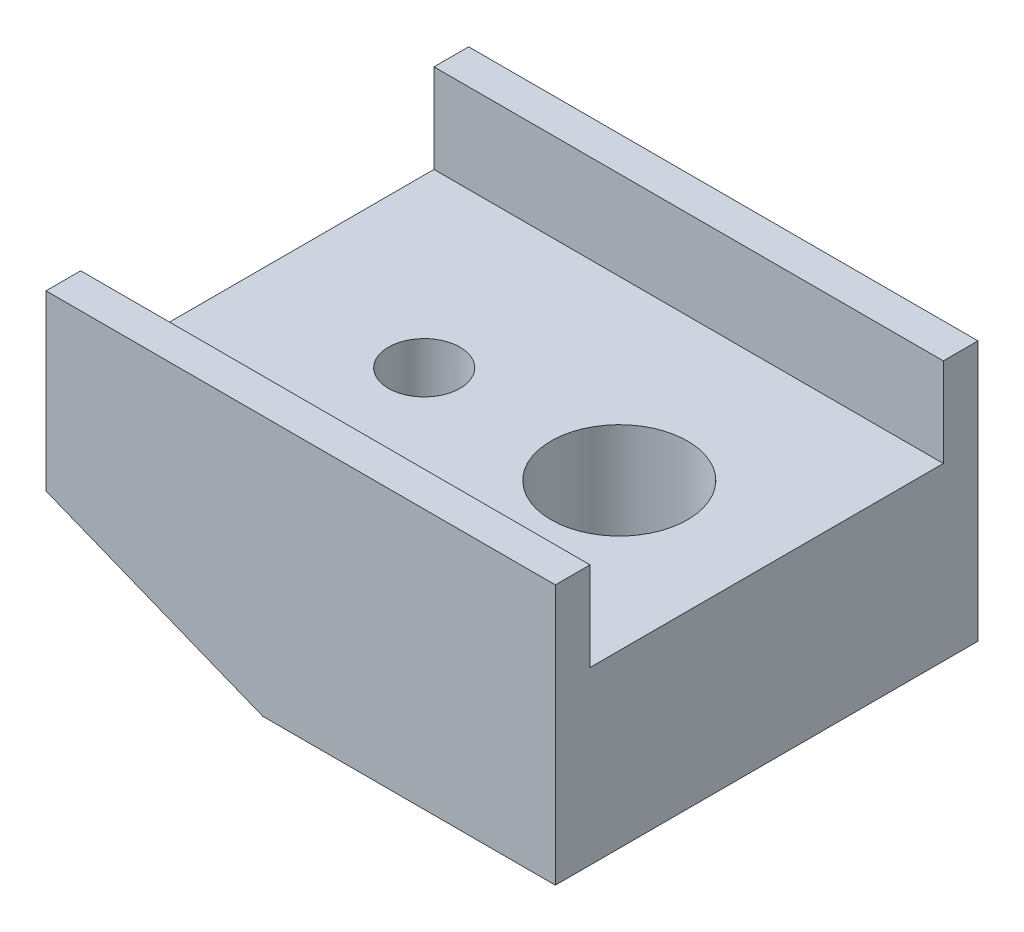
ISO-10303-21;
HEADER;
FILE_DESCRIPTION(('STEP AP214'),'2;1');
FILE_NAME('part.step','',(''),(''),'','','');
FILE_SCHEMA(('AUTOMOTIVE_DESIGN { 1 0 10303 214 1 1 1 1 }'));
ENDSEC;
DATA;
#1=APPLICATION_CONTEXT('core data for automotive mechanical design processes');
#2=APPLICATION_PROTOCOL_DEFINITION('international standard','automotive_design',2000,#1);
#3=PRODUCT_CONTEXT('',#1,'mechanical');
#4=PRODUCT('Part','Part','',(#3));
#5=PRODUCT_RELATED_PRODUCT_CATEGORY('part','',(#4));
#6=PRODUCT_DEFINITION_FORMATION('','',#4);
#7=PRODUCT_DEFINITION_CONTEXT('part definition',#1,'design');
#8=PRODUCT_DEFINITION('design','',#6,#7);
#9=PRODUCT_DEFINITION_SHAPE('','',#8);
#10=(LENGTH_UNIT() NAMED_UNIT(*) SI_UNIT(.MILLI.,.METRE.));
#11=(NAMED_UNIT(*) PLANE_ANGLE_UNIT() SI_UNIT($,.RADIAN.));
#12=(NAMED_UNIT(*) SI_UNIT($,.STERADIAN.) SOLID_ANGLE_UNIT());
#13=UNCERTAINTY_MEASURE_WITH_UNIT(LENGTH_MEASURE(1.E-05),#10,'distance_accuracy_value','');
#14=(GEOMETRIC_REPRESENTATION_CONTEXT(3) GLOBAL_UNCERTAINTY_ASSIGNED_CONTEXT((#13)) GLOBAL_UNIT_ASSIGNED_CONTEXT((#10,
#11,#12)) REPRESENTATION_CONTEXT('',''));
#15=CARTESIAN_POINT('',(0.,0.,0.));
#16=DIRECTION('',(0.,0.,1.));
#17=DIRECTION('',(1.,0.,0.));
#18=AXIS2_PLACEMENT_3D('',#15,#16,#17);
#19=CARTESIAN_POINT('',(0.,12.,19.5));
#20=DIRECTION('',(0.,-1.,0.));
#21=DIRECTION('',(0.,0.,-1.));
#22=AXIS2_PLACEMENT_3D('',#19,#20,#21);
#23=PLANE('',#22);
#24=DIRECTION('',(0.,0.,-1.));
#25=VECTOR('',#24,1.);
#26=CARTESIAN_POINT('',(0.,12.,19.5));
#27=LINE('',#26,#25);
#28=CARTESIAN_POINT('',(0.,12.,19.5));
#29=VERTEX_POINT('',#28);
#30=CARTESIAN_POINT('',(0.,12.,17.9));
#31=VERTEX_POINT('',#30);
#32=EDGE_CURVE('E11',#29,#31,#27,.T.);
#33=ORIENTED_EDGE('',*,*,#32,.T.);
#34=DIRECTION('',(1.,0.,0.));
#35=VECTOR('',#34,1.);
#36=CARTESIAN_POINT('',(-23.5,12.,17.9));
#37=LINE('',#36,#35);
#38=CARTESIAN_POINT('',(-23.5,12.,17.9));
#39=VERTEX_POINT('',#38);
#40=EDGE_CURVE('E172',#39,#31,#37,.T.);
#41=ORIENTED_EDGE('',*,*,#40,.F.);
#42=DIRECTION('',(0.,0.,-1.));
#43=VECTOR('',#42,1.);
#44=CARTESIAN_POINT('',(-23.5,12.,19.5));
#45=LINE('',#44,#43);
#46=CARTESIAN_POINT('',(-23.5,12.,19.5));
#47=VERTEX_POINT('',#46);
#48=EDGE_CURVE('E146',#47,#39,#45,.T.);
#49=ORIENTED_EDGE('',*,*,#48,.F.);
#50=DIRECTION('',(-1.,0.,0.));
#51=VECTOR('',#50,1.);
#52=CARTESIAN_POINT('',(0.,12.,19.5));
#53=LINE('',#52,#51);
#54=EDGE_CURVE('E101',#29,#47,#53,.T.);
#55=ORIENTED_EDGE('',*,*,#54,.F.);
#56=EDGE_LOOP('',(#33,#41,#49,#55));
#57=FACE_BOUND('',#56,.T.);
#58=ADVANCED_FACE('F45',(#57),#23,.F.);
#59=CARTESIAN_POINT('',(0.,0.,19.5));
#60=DIRECTION('',(-1.,0.,0.));
#61=DIRECTION('',(0.,0.,1.));
#62=AXIS2_PLACEMENT_3D('',#59,#60,#61);
#63=PLANE('',#62);
#64=DIRECTION('',(0.,0.,1.));
#65=VECTOR('',#64,1.);
#66=CARTESIAN_POINT('',(0.,7.90000000000001,0.));
#67=LINE('',#66,#65);
#68=CARTESIAN_POINT('',(0.,7.90000000000001,1.6));
#69=VERTEX_POINT('',#68);
#70=CARTESIAN_POINT('',(0.,7.90000000000001,17.9));
#71=VERTEX_POINT('',#70);
#72=EDGE_CURVE('E183',#69,#71,#67,.T.);
#73=ORIENTED_EDGE('',*,*,#72,.T.);
#74=DIRECTION('',(0.,-1.,0.));
#75=VECTOR('',#74,1.);
#76=CARTESIAN_POINT('',(0.,0.,17.9));
#77=LINE('',#76,#75);
#78=EDGE_CURVE('E177',#31,#71,#77,.T.);
#79=ORIENTED_EDGE('',*,*,#78,.F.);
#80=ORIENTED_EDGE('',*,*,#32,.F.);
#81=DIRECTION('',(0.,1.,0.));
#82=VECTOR('',#81,1.);
#83=CARTESIAN_POINT('',(0.,0.,19.5));
#84=LINE('',#83,#82);
#85=CARTESIAN_POINT('',(0.,0.,19.5));
#86=VERTEX_POINT('',#85);
#87=EDGE_CURVE('E144',#86,#29,#84,.T.);
#88=ORIENTED_EDGE('',*,*,#87,.F.);
#89=DIRECTION('',(0.,0.,-1.));
#90=VECTOR('',#89,1.);
#91=CARTESIAN_POINT('',(0.,0.,19.5));
#92=LINE('',#91,#90);
#93=CARTESIAN_POINT('',(0.,0.,0.));
#94=VERTEX_POINT('',#93);
#95=EDGE_CURVE('E129',#86,#94,#92,.T.);
#96=ORIENTED_EDGE('',*,*,#95,.T.);
#97=DIRECTION('',(0.,1.,0.));
#98=VECTOR('',#97,1.);
#99=CARTESIAN_POINT('',(0.,0.,0.));
#100=LINE('',#99,#98);
#101=CARTESIAN_POINT('',(0.,12.,0.));
#102=VERTEX_POINT('',#101);
#103=EDGE_CURVE('E133',#94,#102,#100,.T.);
#104=ORIENTED_EDGE('',*,*,#103,.T.);
#105=CARTESIAN_POINT('',(0.,12.,1.6));
#106=VERTEX_POINT('',#105);
#107=EDGE_CURVE('E53',#106,#102,#27,.T.);
#108=ORIENTED_EDGE('',*,*,#107,.F.);
#109=DIRECTION('',(0.,1.,0.));
#110=VECTOR('',#109,1.);
#111=CARTESIAN_POINT('',(0.,0.,1.6));
#112=LINE('',#111,#110);
#113=EDGE_CURVE('E181',#69,#106,#112,.T.);
#114=ORIENTED_EDGE('',*,*,#113,.F.);
#115=EDGE_LOOP('',(#73,#79,#80,#88,#96,#104,#108,#114));
#116=FACE_BOUND('',#115,.T.);
#117=ADVANCED_FACE('F47',(#116),#63,.F.);
#118=CARTESIAN_POINT('',(-23.5,12.,1.6));
#119=VERTEX_POINT('',#118);
#120=CARTESIAN_POINT('',(-23.5,12.,0.));
#121=VERTEX_POINT('',#120);
#122=EDGE_CURVE('E124',#119,#121,#45,.T.);
#123=ORIENTED_EDGE('',*,*,#122,.F.);
#124=DIRECTION('',(1.,0.,0.));
#125=VECTOR('',#124,1.);
#126=CARTESIAN_POINT('',(-23.5,12.,1.6));
#127=LINE('',#126,#125);
#128=EDGE_CURVE('E60',#119,#106,#127,.T.);
#129=ORIENTED_EDGE('',*,*,#128,.T.);
#130=ORIENTED_EDGE('',*,*,#107,.T.);
#131=DIRECTION('',(-1.,0.,0.));
#132=VECTOR('',#131,1.);
#133=CARTESIAN_POINT('',(0.,12.,0.));
#134=LINE('',#133,#132);
#135=EDGE_CURVE('E136',#102,#121,#134,.T.);
#136=ORIENTED_EDGE('',*,*,#135,.T.);
#137=EDGE_LOOP('',(#123,#129,#130,#136));
#138=FACE_BOUND('',#137,.T.);
#139=ADVANCED_FACE('F154',(#138),#23,.F.);
#140=CARTESIAN_POINT('',(-23.5,4.,19.5));
#141=DIRECTION('',(1.,0.,0.));
#142=DIRECTION('',(0.,1.,0.));
#143=AXIS2_PLACEMENT_3D('',#140,#141,#142);
#144=PLANE('',#143);
#145=ORIENTED_EDGE('',*,*,#48,.T.);
#146=DIRECTION('',(0.,-1.,0.));
#147=VECTOR('',#146,1.);
#148=CARTESIAN_POINT('',(-23.5,0.,17.9));
#149=LINE('',#148,#147);
#150=CARTESIAN_POINT('',(-23.5,7.90000000000001,17.9));
#151=VERTEX_POINT('',#150);
#152=EDGE_CURVE('E170',#39,#151,#149,.T.);
#153=ORIENTED_EDGE('',*,*,#152,.T.);
#154=DIRECTION('',(0.,0.,1.));
#155=VECTOR('',#154,1.);
#156=CARTESIAN_POINT('',(-23.5,7.90000000000001,0.));
#157=LINE('',#156,#155);
#158=CARTESIAN_POINT('',(-23.5,7.90000000000001,1.6));
#159=VERTEX_POINT('',#158);
#160=EDGE_CURVE('E180',#159,#151,#157,.T.);
#161=ORIENTED_EDGE('',*,*,#160,.F.);
#162=DIRECTION('',(0.,1.,0.));
#163=VECTOR('',#162,1.);
#164=CARTESIAN_POINT('',(-23.5,0.,1.6));
#165=LINE('',#164,#163);
#166=EDGE_CURVE('E151',#159,#119,#165,.T.);
#167=ORIENTED_EDGE('',*,*,#166,.T.);
#168=ORIENTED_EDGE('',*,*,#122,.T.);
#169=DIRECTION('',(0.,-1.,0.));
#170=VECTOR('',#169,1.);
#171=CARTESIAN_POINT('',(-23.5,4.,0.));
#172=LINE('',#171,#170);
#173=CARTESIAN_POINT('',(-23.5,4.,0.));
#174=VERTEX_POINT('',#173);
#175=EDGE_CURVE('E121',#121,#174,#172,.T.);
#176=ORIENTED_EDGE('',*,*,#175,.T.);
#177=DIRECTION('',(0.,0.,-1.));
#178=VECTOR('',#177,1.);
#179=CARTESIAN_POINT('',(-23.5,4.,19.5));
#180=LINE('',#179,#178);
#181=CARTESIAN_POINT('',(-23.5,4.,19.5));
#182=VERTEX_POINT('',#181);
#183=EDGE_CURVE('E118',#182,#174,#180,.T.);
#184=ORIENTED_EDGE('',*,*,#183,.F.);
#185=DIRECTION('',(0.,-1.,0.));
#186=VECTOR('',#185,1.);
#187=CARTESIAN_POINT('',(-23.5,4.,19.5));
#188=LINE('',#187,#186);
#189=EDGE_CURVE('E108',#47,#182,#188,.T.);
#190=ORIENTED_EDGE('',*,*,#189,.F.);
#191=EDGE_LOOP('',(#145,#153,#161,#167,#168,#176,#184,#190));
#192=FACE_BOUND('',#191,.T.);
#193=ADVANCED_FACE('F119',(#192),#144,.F.);
#194=CARTESIAN_POINT('',(-13.5,0.,19.5));
#195=DIRECTION('',(0.371390676354103,0.928476690885259,0.));
#196=DIRECTION('',(-0.92847669088526,0.371390676354103,0.));
#197=AXIS2_PLACEMENT_3D('',#194,#195,#196);
#198=PLANE('',#197);
#199=CARTESIAN_POINT('',(-15.8,0.92000000000001,9.75));
#200=DIRECTION('',(0.371390676354103,0.928476690885259,0.));
#201=DIRECTION('',(-0.92847669088526,0.371390676354103,0.));
#202=AXIS2_PLACEMENT_3D('',#199,#200,#201);
#203=ELLIPSE('',#202,1.77710438635438,1.65);
#204=CARTESIAN_POINT('',(-17.45,1.58000000000001,9.75));
#205=VERTEX_POINT('',#204);
#206=EDGE_CURVE('E195',#205,#205,#203,.T.);
#207=ORIENTED_EDGE('',*,*,#206,.T.);
#208=EDGE_LOOP('',(#207));
#209=FACE_BOUND('',#208,.T.);
#210=DIRECTION('',(0.92847669088526,-0.371390676354103,0.));
#211=VECTOR('',#210,1.);
#212=CARTESIAN_POINT('',(-13.5,0.,0.));
#213=LINE('',#212,#211);
#214=CARTESIAN_POINT('',(-13.5,0.,0.));
#215=VERTEX_POINT('',#214);
#216=EDGE_CURVE('E141',#174,#215,#213,.T.);
#217=ORIENTED_EDGE('',*,*,#216,.T.);
#218=DIRECTION('',(0.,0.,-1.));
#219=VECTOR('',#218,1.);
#220=CARTESIAN_POINT('',(-13.5,0.,19.5));
#221=LINE('',#220,#219);
#222=CARTESIAN_POINT('',(-13.5,0.,19.5));
#223=VERTEX_POINT('',#222);
#224=EDGE_CURVE('E125',#223,#215,#221,.T.);
#225=ORIENTED_EDGE('',*,*,#224,.F.);
#226=DIRECTION('',(0.92847669088526,-0.371390676354103,0.));
#227=VECTOR('',#226,1.);
#228=CARTESIAN_POINT('',(-13.5,0.,19.5));
#229=LINE('',#228,#227);
#230=EDGE_CURVE('E112',#182,#223,#229,.T.);
#231=ORIENTED_EDGE('',*,*,#230,.F.);
#232=ORIENTED_EDGE('',*,*,#183,.T.);
#233=EDGE_LOOP('',(#217,#225,#231,#232));
#234=FACE_BOUND('',#233,.T.);
#235=ADVANCED_FACE('F127',(#209,#234),#198,.F.);
#236=CARTESIAN_POINT('',(0.,0.,19.5));
#237=DIRECTION('',(0.,1.,0.));
#238=DIRECTION('',(-1.,0.,0.));
#239=AXIS2_PLACEMENT_3D('',#236,#237,#238);
#240=PLANE('',#239);
#241=CARTESIAN_POINT('',(-6.8,0.,9.75));
#242=DIRECTION('',(0.,1.,0.));
#243=DIRECTION('',(0.,0.,1.));
#244=AXIS2_PLACEMENT_3D('',#241,#242,#243);
#245=CIRCLE('',#244,3.14999999999999);
#246=CARTESIAN_POINT('',(-6.8,0.,12.9));
#247=VERTEX_POINT('',#246);
#248=EDGE_CURVE('E192',#247,#247,#245,.T.);
#249=ORIENTED_EDGE('',*,*,#248,.T.);
#250=EDGE_LOOP('',(#249));
#251=FACE_BOUND('',#250,.T.);
#252=DIRECTION('',(1.,0.,0.));
#253=VECTOR('',#252,1.);
#254=CARTESIAN_POINT('',(0.,0.,0.));
#255=LINE('',#254,#253);
#256=EDGE_CURVE('E93',#215,#94,#255,.T.);
#257=ORIENTED_EDGE('',*,*,#256,.T.);
#258=ORIENTED_EDGE('',*,*,#95,.F.);
#259=DIRECTION('',(1.,0.,0.));
#260=VECTOR('',#259,1.);
#261=CARTESIAN_POINT('',(0.,0.,19.5));
#262=LINE('',#261,#260);
#263=EDGE_CURVE('E69',#223,#86,#262,.T.);
#264=ORIENTED_EDGE('',*,*,#263,.F.);
#265=ORIENTED_EDGE('',*,*,#224,.T.);
#266=EDGE_LOOP('',(#257,#258,#264,#265));
#267=FACE_BOUND('',#266,.T.);
#268=ADVANCED_FACE('F159',(#251,#267),#240,.F.);
#269=CARTESIAN_POINT('',(0.,12.,19.5));
#270=DIRECTION('',(0.,0.,1.));
#271=DIRECTION('',(1.,0.,0.));
#272=AXIS2_PLACEMENT_3D('',#269,#270,#271);
#273=PLANE('',#272);
#274=ORIENTED_EDGE('',*,*,#87,.T.);
#275=ORIENTED_EDGE('',*,*,#54,.T.);
#276=ORIENTED_EDGE('',*,*,#189,.T.);
#277=ORIENTED_EDGE('',*,*,#230,.T.);
#278=ORIENTED_EDGE('',*,*,#263,.T.);
#279=EDGE_LOOP('',(#274,#275,#276,#277,#278));
#280=FACE_BOUND('',#279,.T.);
#281=ADVANCED_FACE('F110',(#280),#273,.T.);
#282=CARTESIAN_POINT('',(0.,12.,0.));
#283=DIRECTION('',(0.,0.,1.));
#284=DIRECTION('',(1.,0.,0.));
#285=AXIS2_PLACEMENT_3D('',#282,#283,#284);
#286=PLANE('',#285);
#287=ORIENTED_EDGE('',*,*,#103,.F.);
#288=ORIENTED_EDGE('',*,*,#256,.F.);
#289=ORIENTED_EDGE('',*,*,#216,.F.);
#290=ORIENTED_EDGE('',*,*,#175,.F.);
#291=ORIENTED_EDGE('',*,*,#135,.F.);
#292=EDGE_LOOP('',(#287,#288,#289,#290,#291));
#293=FACE_BOUND('',#292,.T.);
#294=ADVANCED_FACE('F158',(#293),#286,.F.);
#295=CARTESIAN_POINT('',(-23.5,7.90000000000001,0.));
#296=DIRECTION('',(0.,1.,0.));
#297=DIRECTION('',(0.,0.,1.));
#298=AXIS2_PLACEMENT_3D('',#295,#296,#297);
#299=PLANE('',#298);
#300=CARTESIAN_POINT('',(-15.8,7.90000000000001,9.75));
#301=DIRECTION('',(0.,1.,0.));
#302=DIRECTION('',(0.,0.,1.));
#303=AXIS2_PLACEMENT_3D('',#300,#301,#302);
#304=CIRCLE('',#303,1.65);
#305=CARTESIAN_POINT('',(-15.8,7.90000000000001,11.4));
#306=VERTEX_POINT('',#305);
#307=EDGE_CURVE('E198',#306,#306,#304,.T.);
#308=ORIENTED_EDGE('',*,*,#307,.F.);
#309=EDGE_LOOP('',(#308));
#310=FACE_BOUND('',#309,.T.);
#311=CARTESIAN_POINT('',(-6.8,7.90000000000001,9.75));
#312=DIRECTION('',(0.,1.,0.));
#313=DIRECTION('',(0.,0.,1.));
#314=AXIS2_PLACEMENT_3D('',#311,#312,#313);
#315=CIRCLE('',#314,3.15);
#316=CARTESIAN_POINT('',(-6.8,7.90000000000001,12.9));
#317=VERTEX_POINT('',#316);
#318=EDGE_CURVE('E185',#317,#317,#315,.T.);
#319=ORIENTED_EDGE('',*,*,#318,.F.);
#320=EDGE_LOOP('',(#319));
#321=FACE_BOUND('',#320,.T.);
#322=ORIENTED_EDGE('',*,*,#72,.F.);
#323=DIRECTION('',(1.,0.,0.));
#324=VECTOR('',#323,1.);
#325=CARTESIAN_POINT('',(-23.5,7.90000000000001,1.6));
#326=LINE('',#325,#324);
#327=EDGE_CURVE('E167',#159,#69,#326,.T.);
#328=ORIENTED_EDGE('',*,*,#327,.F.);
#329=ORIENTED_EDGE('',*,*,#160,.T.);
#330=DIRECTION('',(1.,0.,0.));
#331=VECTOR('',#330,1.);
#332=CARTESIAN_POINT('',(-23.5,7.90000000000001,17.9));
#333=LINE('',#332,#331);
#334=EDGE_CURVE('E137',#151,#71,#333,.T.);
#335=ORIENTED_EDGE('',*,*,#334,.T.);
#336=EDGE_LOOP('',(#322,#328,#329,#335));
#337=FACE_BOUND('',#336,.T.);
#338=ADVANCED_FACE('F205',(#310,#321,#337),#299,.T.);
#339=CARTESIAN_POINT('',(-23.5,0.,17.9));
#340=DIRECTION('',(0.,0.,1.));
#341=DIRECTION('',(1.,0.,0.));
#342=AXIS2_PLACEMENT_3D('',#339,#340,#341);
#343=PLANE('',#342);
#344=ORIENTED_EDGE('',*,*,#78,.T.);
#345=ORIENTED_EDGE('',*,*,#334,.F.);
#346=ORIENTED_EDGE('',*,*,#152,.F.);
#347=ORIENTED_EDGE('',*,*,#40,.T.);
#348=EDGE_LOOP('',(#344,#345,#346,#347));
#349=FACE_BOUND('',#348,.T.);
#350=ADVANCED_FACE('F208',(#349),#343,.F.);
#351=CARTESIAN_POINT('',(-23.5,0.,1.6));
#352=DIRECTION('',(0.,0.,-1.));
#353=DIRECTION('',(-1.,0.,0.));
#354=AXIS2_PLACEMENT_3D('',#351,#352,#353);
#355=PLANE('',#354);
#356=ORIENTED_EDGE('',*,*,#113,.T.);
#357=ORIENTED_EDGE('',*,*,#128,.F.);
#358=ORIENTED_EDGE('',*,*,#166,.F.);
#359=ORIENTED_EDGE('',*,*,#327,.T.);
#360=EDGE_LOOP('',(#356,#357,#358,#359));
#361=FACE_BOUND('',#360,.T.);
#362=ADVANCED_FACE('F220',(#361),#355,.F.);
#363=CARTESIAN_POINT('',(-6.8,7.90000000000001,9.75));
#364=DIRECTION('',(0.,1.,0.));
#365=DIRECTION('',(0.,0.,1.));
#366=AXIS2_PLACEMENT_3D('',#363,#364,#365);
#367=CYLINDRICAL_SURFACE('',#366,3.15);
#368=ORIENTED_EDGE('',*,*,#248,.F.);
#369=EDGE_LOOP('',(#368));
#370=FACE_BOUND('',#369,.T.);
#371=ORIENTED_EDGE('',*,*,#318,.T.);
#372=EDGE_LOOP('',(#371));
#373=FACE_BOUND('',#372,.T.);
#374=ADVANCED_FACE('F254',(#370,#373),#367,.F.);
#375=CARTESIAN_POINT('',(-15.8,7.90000000000001,9.75));
#376=DIRECTION('',(0.,1.,0.));
#377=DIRECTION('',(0.,0.,1.));
#378=AXIS2_PLACEMENT_3D('',#375,#376,#377);
#379=CYLINDRICAL_SURFACE('',#378,1.65);
#380=ORIENTED_EDGE('',*,*,#307,.T.);
#381=EDGE_LOOP('',(#380));
#382=FACE_BOUND('',#381,.T.);
#383=ORIENTED_EDGE('',*,*,#206,.F.);
#384=EDGE_LOOP('',(#383));
#385=FACE_BOUND('',#384,.T.);
#386=ADVANCED_FACE('F202',(#382,#385),#379,.F.);
#387=CLOSED_SHELL('',(#58,#117,#139,#193,#235,#268,#281,#294,#338,#350,#362,#374,#386));
#388=MANIFOLD_SOLID_BREP('B2',#387);
#389=ADVANCED_BREP_SHAPE_REPRESENTATION('',(#18,#388),#14);
#390=SHAPE_DEFINITION_REPRESENTATION(#9,#389);
ENDSEC;
END-ISO-10303-21;
